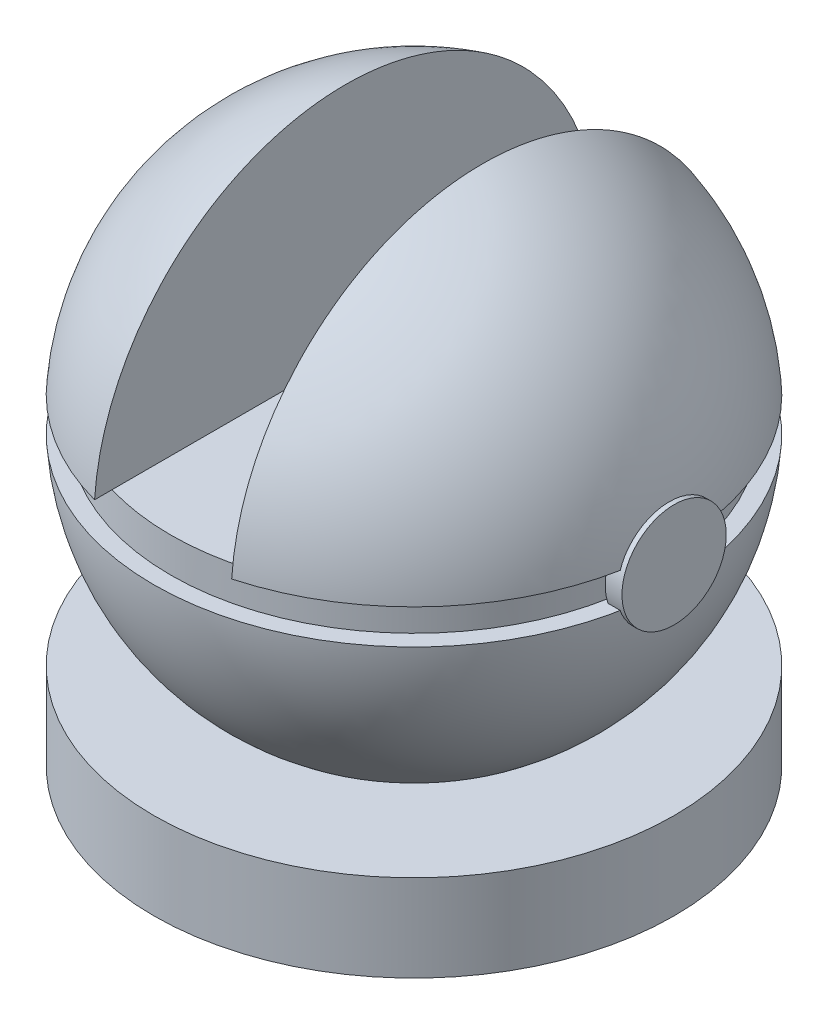
ISO-10303-21;
HEADER;
FILE_DESCRIPTION(('STEP AP214'),'2;1');
FILE_NAME('part.step','',(''),(''),'','','');
FILE_SCHEMA(('AUTOMOTIVE_DESIGN { 1 0 10303 214 1 1 1 1 }'));
ENDSEC;
DATA;
#1=APPLICATION_CONTEXT('core data for automotive mechanical design processes');
#2=APPLICATION_PROTOCOL_DEFINITION('international standard','automotive_design',2000,#1);
#3=PRODUCT_CONTEXT('',#1,'mechanical');
#4=PRODUCT('Part','Part','',(#3));
#5=PRODUCT_RELATED_PRODUCT_CATEGORY('part','',(#4));
#6=PRODUCT_DEFINITION_FORMATION('','',#4);
#7=PRODUCT_DEFINITION_CONTEXT('part definition',#1,'design');
#8=PRODUCT_DEFINITION('design','',#6,#7);
#9=PRODUCT_DEFINITION_SHAPE('','',#8);
#10=(LENGTH_UNIT() NAMED_UNIT(*) SI_UNIT(.MILLI.,.METRE.));
#11=(NAMED_UNIT(*) PLANE_ANGLE_UNIT() SI_UNIT($,.RADIAN.));
#12=(NAMED_UNIT(*) SI_UNIT($,.STERADIAN.) SOLID_ANGLE_UNIT());
#13=UNCERTAINTY_MEASURE_WITH_UNIT(LENGTH_MEASURE(1.E-05),#10,'distance_accuracy_value','');
#14=(GEOMETRIC_REPRESENTATION_CONTEXT(3) GLOBAL_UNCERTAINTY_ASSIGNED_CONTEXT((#13)) GLOBAL_UNIT_ASSIGNED_CONTEXT((#10,
#11,#12)) REPRESENTATION_CONTEXT('',''));
#15=CARTESIAN_POINT('',(0.,0.,0.));
#16=DIRECTION('',(0.,0.,1.));
#17=DIRECTION('',(1.,0.,0.));
#18=AXIS2_PLACEMENT_3D('',#15,#16,#17);
#19=CARTESIAN_POINT('',(0.,-31.75,0.));
#20=DIRECTION('',(0.,-1.,0.));
#21=DIRECTION('',(0.,0.,-1.));
#22=AXIS2_PLACEMENT_3D('',#19,#20,#21);
#23=CYLINDRICAL_SURFACE('',#22,38.0152390496232);
#24=CARTESIAN_POINT('',(0.,-31.75,0.));
#25=DIRECTION('',(0.,-1.,0.));
#26=DIRECTION('',(0.,0.,-1.));
#27=AXIS2_PLACEMENT_3D('',#24,#25,#26);
#28=CIRCLE('',#27,38.0152390496232);
#29=CARTESIAN_POINT('',(0.,-31.75,-38.0152390496232));
#30=VERTEX_POINT('',#29);
#31=EDGE_CURVE('E11',#30,#30,#28,.T.);
#32=ORIENTED_EDGE('',*,*,#31,.T.);
#33=EDGE_LOOP('',(#32));
#34=FACE_BOUND('',#33,.T.);
#35=CARTESIAN_POINT('',(0.,-44.45,0.));
#36=DIRECTION('',(0.,-1.,0.));
#37=DIRECTION('',(0.,0.,-1.));
#38=AXIS2_PLACEMENT_3D('',#35,#36,#37);
#39=CIRCLE('',#38,38.0152390496232);
#40=CARTESIAN_POINT('',(0.,-44.45,-38.0152390496232));
#41=VERTEX_POINT('',#40);
#42=EDGE_CURVE('E52',#41,#41,#39,.T.);
#43=ORIENTED_EDGE('',*,*,#42,.F.);
#44=EDGE_LOOP('',(#43));
#45=FACE_BOUND('',#44,.T.);
#46=ADVANCED_FACE('F46',(#34,#45),#23,.T.);
#47=CARTESIAN_POINT('',(0.,-31.75,0.));
#48=DIRECTION('',(0.,-1.,0.));
#49=DIRECTION('',(0.,0.,-1.));
#50=AXIS2_PLACEMENT_3D('',#47,#48,#49);
#51=PLANE('',#50);
#52=ORIENTED_EDGE('',*,*,#31,.F.);
#53=EDGE_LOOP('',(#52));
#54=FACE_BOUND('',#53,.T.);
#55=ADVANCED_FACE('F61',(#54),#51,.F.);
#56=CARTESIAN_POINT('',(0.,-44.45,0.));
#57=DIRECTION('',(0.,-1.,0.));
#58=DIRECTION('',(0.,0.,-1.));
#59=AXIS2_PLACEMENT_3D('',#56,#57,#58);
#60=PLANE('',#59);
#61=ORIENTED_EDGE('',*,*,#42,.T.);
#62=EDGE_LOOP('',(#61));
#63=FACE_BOUND('',#62,.T.);
#64=ADVANCED_FACE('F58',(#63),#60,.T.);
#65=CLOSED_SHELL('',(#46,#55,#64));
#66=MANIFOLD_SOLID_BREP('B2',#65);
#67=CARTESIAN_POINT('',(38.0152390496232,0.,0.));
#68=DIRECTION('',(-1.,0.,0.));
#69=DIRECTION('',(0.,0.,1.));
#70=AXIS2_PLACEMENT_3D('',#67,#68,#69);
#71=CYLINDRICAL_SURFACE('',#70,7.62);
#72=CARTESIAN_POINT('',(38.0152390496232,0.,0.));
#73=DIRECTION('',(1.,0.,0.));
#74=DIRECTION('',(0.,0.,-1.));
#75=AXIS2_PLACEMENT_3D('',#72,#73,#74);
#76=CIRCLE('',#75,7.62);
#77=CARTESIAN_POINT('',(38.0152390496232,0.,-7.62));
#78=VERTEX_POINT('',#77);
#79=EDGE_CURVE('E45',#78,#78,#76,.T.);
#80=ORIENTED_EDGE('',*,*,#79,.F.);
#81=EDGE_LOOP('',(#80));
#82=FACE_BOUND('',#81,.T.);
#83=CARTESIAN_POINT('',(35.56,0.,0.));
#84=DIRECTION('',(1.,0.,0.));
#85=DIRECTION('',(0.,0.,-1.));
#86=AXIS2_PLACEMENT_3D('',#83,#84,#85);
#87=CIRCLE('',#86,7.62);
#88=CARTESIAN_POINT('',(35.56,0.,-7.62));
#89=VERTEX_POINT('',#88);
#90=EDGE_CURVE('E99',#89,#89,#87,.T.);
#91=ORIENTED_EDGE('',*,*,#90,.T.);
#92=EDGE_LOOP('',(#91));
#93=FACE_BOUND('',#92,.T.);
#94=ADVANCED_FACE('F96',(#82,#93),#71,.T.);
#95=CARTESIAN_POINT('',(38.0152390496232,0.,0.));
#96=DIRECTION('',(1.,0.,0.));
#97=DIRECTION('',(0.,0.,-1.));
#98=AXIS2_PLACEMENT_3D('',#95,#96,#97);
#99=PLANE('',#98);
#100=ORIENTED_EDGE('',*,*,#79,.T.);
#101=EDGE_LOOP('',(#100));
#102=FACE_BOUND('',#101,.T.);
#103=ADVANCED_FACE('F111',(#102),#99,.T.);
#104=CARTESIAN_POINT('',(35.56,0.,0.));
#105=DIRECTION('',(1.,0.,0.));
#106=DIRECTION('',(0.,0.,-1.));
#107=AXIS2_PLACEMENT_3D('',#104,#105,#106);
#108=PLANE('',#107);
#109=ORIENTED_EDGE('',*,*,#90,.F.);
#110=EDGE_LOOP('',(#109));
#111=FACE_BOUND('',#110,.T.);
#112=ADVANCED_FACE('F109',(#111),#108,.F.);
#113=CLOSED_SHELL('',(#94,#103,#112));
#114=MANIFOLD_SOLID_BREP('B6',#113);
#115=CARTESIAN_POINT('',(0.,0.,0.));
#116=DIRECTION('',(0.,1.,0.));
#117=DIRECTION('',(1.,0.,0.));
#118=AXIS2_PLACEMENT_3D('',#115,#116,#117);
#119=SPHERICAL_SURFACE('',#118,38.1);
#120=CARTESIAN_POINT('',(10.0203,0.,0.));
#121=DIRECTION('',(1.,0.,0.));
#122=DIRECTION('',(0.,1.,0.));
#123=AXIS2_PLACEMENT_3D('',#120,#121,#122);
#124=CIRCLE('',#123,36.7587212496572);
#125=CARTESIAN_POINT('',(10.0203,2.54,36.6708602013915));
#126=VERTEX_POINT('',#125);
#127=CARTESIAN_POINT('',(10.0203,2.54,-36.6708602013915));
#128=VERTEX_POINT('',#127);
#129=EDGE_CURVE('E179',#126,#128,#124,.F.);
#130=ORIENTED_EDGE('',*,*,#129,.F.);
#131=CARTESIAN_POINT('',(0.,2.54,0.));
#132=DIRECTION('',(0.,1.,0.));
#133=DIRECTION('',(0.,0.,1.));
#134=AXIS2_PLACEMENT_3D('',#131,#132,#133);
#135=CIRCLE('',#134,38.0152390496232);
#136=EDGE_CURVE('E94',#126,#128,#135,.T.);
#137=ORIENTED_EDGE('',*,*,#136,.T.);
#138=EDGE_LOOP('',(#130,#137));
#139=FACE_BOUND('',#138,.T.);
#140=ADVANCED_FACE('F137',(#139),#119,.T.);
#141=CARTESIAN_POINT('',(-35.56,2.54,0.));
#142=DIRECTION('',(0.,-1.,0.));
#143=DIRECTION('',(0.,0.,-1.));
#144=AXIS2_PLACEMENT_3D('',#141,#142,#143);
#145=PLANE('',#144);
#146=DIRECTION('',(0.,0.,1.));
#147=VECTOR('',#146,1.);
#148=CARTESIAN_POINT('',(10.0203,2.54,-38.0152390496232));
#149=LINE('',#148,#147);
#150=CARTESIAN_POINT('',(10.0203,2.54,-34.119015048943));
#151=VERTEX_POINT('',#150);
#152=EDGE_CURVE('E183',#128,#151,#149,.T.);
#153=ORIENTED_EDGE('',*,*,#152,.F.);
#154=ORIENTED_EDGE('',*,*,#136,.F.);
#155=CARTESIAN_POINT('',(10.0203,2.54,34.119015048943));
#156=VERTEX_POINT('',#155);
#157=EDGE_CURVE('E186',#156,#126,#149,.T.);
#158=ORIENTED_EDGE('',*,*,#157,.F.);
#159=CARTESIAN_POINT('',(0.,2.54,0.));
#160=DIRECTION('',(0.,1.,0.));
#161=DIRECTION('',(0.,0.,1.));
#162=AXIS2_PLACEMENT_3D('',#159,#160,#161);
#163=CIRCLE('',#162,35.56);
#164=EDGE_CURVE('E196',#156,#151,#163,.T.);
#165=ORIENTED_EDGE('',*,*,#164,.T.);
#166=EDGE_LOOP('',(#153,#154,#158,#165));
#167=FACE_BOUND('',#166,.T.);
#168=ADVANCED_FACE('F194',(#167),#145,.T.);
#169=CARTESIAN_POINT('',(-10.0203,0.,0.));
#170=DIRECTION('',(-1.,0.,0.));
#171=DIRECTION('',(0.,-1.,0.));
#172=AXIS2_PLACEMENT_3D('',#169,#170,#171);
#173=CIRCLE('',#172,36.7587212496572);
#174=CARTESIAN_POINT('',(-10.0203,2.54,-36.6708602013915));
#175=VERTEX_POINT('',#174);
#176=CARTESIAN_POINT('',(-10.0203,2.54,36.6708602013915));
#177=VERTEX_POINT('',#176);
#178=EDGE_CURVE('E160',#175,#177,#173,.F.);
#179=ORIENTED_EDGE('',*,*,#178,.F.);
#180=EDGE_CURVE('E141',#175,#177,#135,.T.);
#181=ORIENTED_EDGE('',*,*,#180,.T.);
#182=EDGE_LOOP('',(#179,#181));
#183=FACE_BOUND('',#182,.T.);
#184=ADVANCED_FACE('F139',(#183),#119,.T.);
#185=DIRECTION('',(0.,0.,1.));
#186=VECTOR('',#185,1.);
#187=CARTESIAN_POINT('',(-10.0203,2.54,-38.0152390496232));
#188=LINE('',#187,#186);
#189=CARTESIAN_POINT('',(-10.0203,2.54,34.119015048943));
#190=VERTEX_POINT('',#189);
#191=EDGE_CURVE('E220',#190,#177,#188,.T.);
#192=ORIENTED_EDGE('',*,*,#191,.T.);
#193=ORIENTED_EDGE('',*,*,#180,.F.);
#194=CARTESIAN_POINT('',(-10.0203,2.54,-34.119015048943));
#195=VERTEX_POINT('',#194);
#196=EDGE_CURVE('E218',#175,#195,#188,.T.);
#197=ORIENTED_EDGE('',*,*,#196,.T.);
#198=EDGE_CURVE('E226',#195,#190,#163,.T.);
#199=ORIENTED_EDGE('',*,*,#198,.T.);
#200=EDGE_LOOP('',(#192,#193,#197,#199));
#201=FACE_BOUND('',#200,.T.);
#202=ADVANCED_FACE('F204',(#201),#145,.T.);
#203=CARTESIAN_POINT('',(0.,38.1,0.));
#204=DIRECTION('',(0.,1.,0.));
#205=DIRECTION('',(0.,0.,1.));
#206=AXIS2_PLACEMENT_3D('',#203,#204,#205);
#207=CYLINDRICAL_SURFACE('',#206,35.56);
#208=CARTESIAN_POINT('',(0.,-2.54,0.));
#209=DIRECTION('',(0.,1.,0.));
#210=DIRECTION('',(0.,0.,1.));
#211=AXIS2_PLACEMENT_3D('',#208,#209,#210);
#212=CIRCLE('',#211,35.56);
#213=CARTESIAN_POINT('',(0.,-2.54,35.56));
#214=VERTEX_POINT('',#213);
#215=EDGE_CURVE('E229',#214,#214,#212,.T.);
#216=ORIENTED_EDGE('',*,*,#215,.T.);
#217=EDGE_LOOP('',(#216));
#218=FACE_BOUND('',#217,.T.);
#219=ORIENTED_EDGE('',*,*,#164,.F.);
#220=EDGE_CURVE('E224',#190,#156,#163,.T.);
#221=ORIENTED_EDGE('',*,*,#220,.F.);
#222=ORIENTED_EDGE('',*,*,#198,.F.);
#223=EDGE_CURVE('E223',#151,#195,#163,.T.);
#224=ORIENTED_EDGE('',*,*,#223,.F.);
#225=EDGE_LOOP('',(#219,#221,#222,#224));
#226=FACE_BOUND('',#225,.T.);
#227=ADVANCED_FACE('F210',(#218,#226),#207,.T.);
#228=CARTESIAN_POINT('',(-35.56,-2.53999999999999,0.));
#229=DIRECTION('',(0.,1.,0.));
#230=DIRECTION('',(0.,0.,1.));
#231=AXIS2_PLACEMENT_3D('',#228,#229,#230);
#232=PLANE('',#231);
#233=CARTESIAN_POINT('',(0.,-2.53999999999999,0.));
#234=DIRECTION('',(0.,1.,0.));
#235=DIRECTION('',(0.,0.,1.));
#236=AXIS2_PLACEMENT_3D('',#233,#234,#235);
#237=CIRCLE('',#236,38.0152390496232);
#238=CARTESIAN_POINT('',(0.,-2.53999999999999,38.0152390496232));
#239=VERTEX_POINT('',#238);
#240=EDGE_CURVE('E190',#239,#239,#237,.T.);
#241=ORIENTED_EDGE('',*,*,#240,.T.);
#242=EDGE_LOOP('',(#241));
#243=FACE_BOUND('',#242,.T.);
#244=ORIENTED_EDGE('',*,*,#215,.F.);
#245=EDGE_LOOP('',(#244));
#246=FACE_BOUND('',#245,.T.);
#247=ADVANCED_FACE('F260',(#243,#246),#232,.T.);
#248=CARTESIAN_POINT('',(0.,0.,0.));
#249=DIRECTION('',(0.,1.,0.));
#250=DIRECTION('',(-1.,0.,0.));
#251=AXIS2_PLACEMENT_3D('',#248,#249,#250);
#252=SPHERICAL_SURFACE('',#251,38.1);
#253=ORIENTED_EDGE('',*,*,#240,.F.);
#254=EDGE_LOOP('',(#253));
#255=FACE_BOUND('',#254,.T.);
#256=ADVANCED_FACE('F257',(#255),#252,.T.);
#257=CARTESIAN_POINT('',(10.0203,2.54,-38.0152390496232));
#258=DIRECTION('',(1.,0.,0.));
#259=DIRECTION('',(0.,1.,0.));
#260=AXIS2_PLACEMENT_3D('',#257,#258,#259);
#261=PLANE('',#260);
#262=ORIENTED_EDGE('',*,*,#129,.T.);
#263=ORIENTED_EDGE('',*,*,#152,.T.);
#264=EDGE_CURVE('E198',#151,#156,#149,.T.);
#265=ORIENTED_EDGE('',*,*,#264,.T.);
#266=ORIENTED_EDGE('',*,*,#157,.T.);
#267=EDGE_LOOP('',(#262,#263,#265,#266));
#268=FACE_BOUND('',#267,.T.);
#269=ADVANCED_FACE('F181',(#268),#261,.F.);
#270=CARTESIAN_POINT('',(-10.0203,2.54,-38.0152390496232));
#271=DIRECTION('',(0.,-1.,0.));
#272=DIRECTION('',(1.,0.,0.));
#273=AXIS2_PLACEMENT_3D('',#270,#271,#272);
#274=PLANE('',#273);
#275=ORIENTED_EDGE('',*,*,#223,.T.);
#276=EDGE_CURVE('E153',#195,#190,#188,.T.);
#277=ORIENTED_EDGE('',*,*,#276,.T.);
#278=ORIENTED_EDGE('',*,*,#220,.T.);
#279=ORIENTED_EDGE('',*,*,#264,.F.);
#280=EDGE_LOOP('',(#275,#277,#278,#279));
#281=FACE_BOUND('',#280,.T.);
#282=ADVANCED_FACE('F246',(#281),#274,.F.);
#283=CARTESIAN_POINT('',(-10.0203,38.1,-38.0152390496232));
#284=DIRECTION('',(-1.,0.,0.));
#285=DIRECTION('',(0.,-1.,0.));
#286=AXIS2_PLACEMENT_3D('',#283,#284,#285);
#287=PLANE('',#286);
#288=ORIENTED_EDGE('',*,*,#178,.T.);
#289=ORIENTED_EDGE('',*,*,#191,.F.);
#290=ORIENTED_EDGE('',*,*,#276,.F.);
#291=ORIENTED_EDGE('',*,*,#196,.F.);
#292=EDGE_LOOP('',(#288,#289,#290,#291));
#293=FACE_BOUND('',#292,.T.);
#294=ADVANCED_FACE('F247',(#293),#287,.F.);
#295=CLOSED_SHELL('',(#140,#168,#184,#202,#227,#247,#256,#269,#282,#294));
#296=MANIFOLD_SOLID_BREP('B40',#295);
#297=ADVANCED_BREP_SHAPE_REPRESENTATION('',(#18,#66,#114,#296),#14);
#298=SHAPE_DEFINITION_REPRESENTATION(#9,#297);
ENDSEC;
END-ISO-10303-21;
